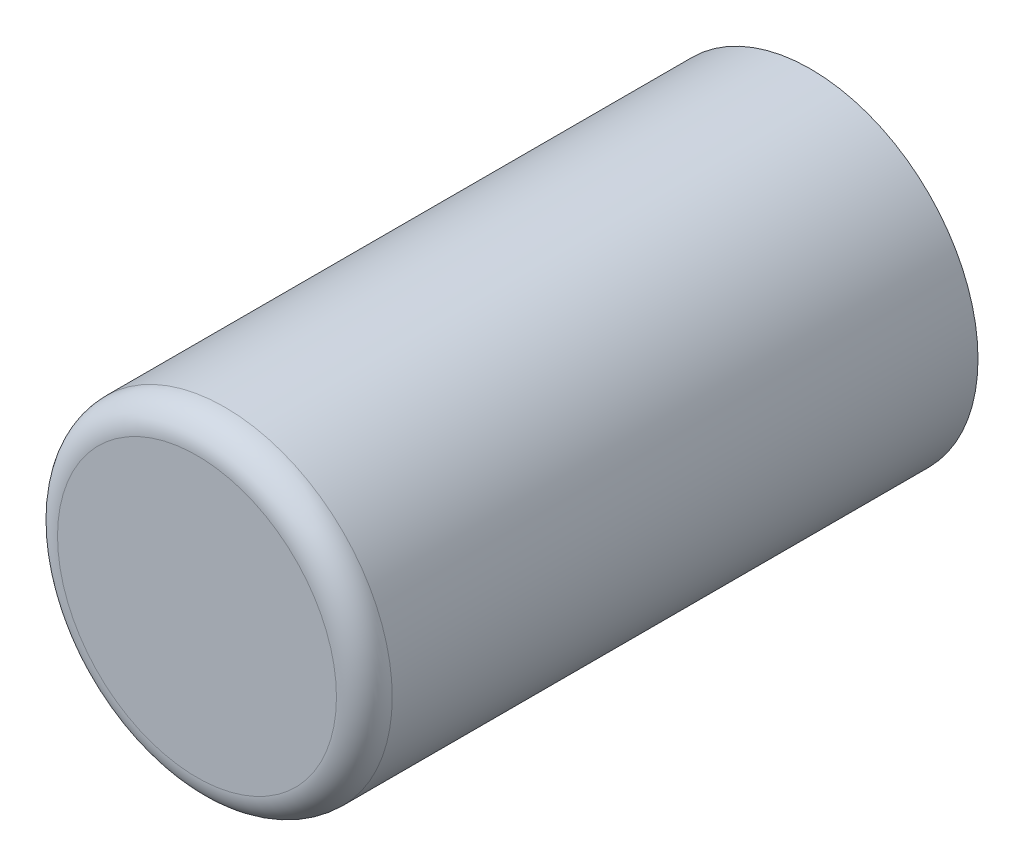
ISO-10303-21;
HEADER;
FILE_DESCRIPTION(('STEP AP214'),'2;1');
FILE_NAME('part.step','',(''),(''),'','','');
FILE_SCHEMA(('AUTOMOTIVE_DESIGN { 1 0 10303 214 1 1 1 1 }'));
ENDSEC;
DATA;
#1=APPLICATION_CONTEXT('core data for automotive mechanical design processes');
#2=APPLICATION_PROTOCOL_DEFINITION('international standard','automotive_design',2000,#1);
#3=PRODUCT_CONTEXT('',#1,'mechanical');
#4=PRODUCT('Part','Part','',(#3));
#5=PRODUCT_RELATED_PRODUCT_CATEGORY('part','',(#4));
#6=PRODUCT_DEFINITION_FORMATION('','',#4);
#7=PRODUCT_DEFINITION_CONTEXT('part definition',#1,'design');
#8=PRODUCT_DEFINITION('design','',#6,#7);
#9=PRODUCT_DEFINITION_SHAPE('','',#8);
#10=(LENGTH_UNIT() NAMED_UNIT(*) SI_UNIT(.MILLI.,.METRE.));
#11=(NAMED_UNIT(*) PLANE_ANGLE_UNIT() SI_UNIT($,.RADIAN.));
#12=(NAMED_UNIT(*) SI_UNIT($,.STERADIAN.) SOLID_ANGLE_UNIT());
#13=UNCERTAINTY_MEASURE_WITH_UNIT(LENGTH_MEASURE(1.E-05),#10,'distance_accuracy_value','');
#14=(GEOMETRIC_REPRESENTATION_CONTEXT(3) GLOBAL_UNCERTAINTY_ASSIGNED_CONTEXT((#13)) GLOBAL_UNIT_ASSIGNED_CONTEXT((#10,
#11,#12)) REPRESENTATION_CONTEXT('',''));
#15=CARTESIAN_POINT('',(0.,0.,0.));
#16=DIRECTION('',(0.,0.,1.));
#17=DIRECTION('',(1.,0.,0.));
#18=AXIS2_PLACEMENT_3D('',#15,#16,#17);
#19=CARTESIAN_POINT('',(0.,0.,110.));
#20=DIRECTION('',(0.,0.,-1.));
#21=DIRECTION('',(-1.,0.,0.));
#22=AXIS2_PLACEMENT_3D('',#19,#20,#21);
#23=CYLINDRICAL_SURFACE('',#22,30.);
#24=CARTESIAN_POINT('',(0.,0.,105.));
#25=DIRECTION('',(0.,0.,1.));
#26=DIRECTION('',(1.,0.,0.));
#27=AXIS2_PLACEMENT_3D('',#24,#25,#26);
#28=CIRCLE('',#27,30.);
#29=CARTESIAN_POINT('',(30.,0.,105.));
#30=VERTEX_POINT('',#29);
#31=EDGE_CURVE('E10',#30,#30,#28,.F.);
#32=ORIENTED_EDGE('',*,*,#31,.T.);
#33=EDGE_LOOP('',(#32));
#34=FACE_BOUND('',#33,.T.);
#35=CARTESIAN_POINT('',(0.,0.,0.));
#36=DIRECTION('',(0.,0.,1.));
#37=DIRECTION('',(1.,0.,0.));
#38=AXIS2_PLACEMENT_3D('',#35,#36,#37);
#39=CIRCLE('',#38,30.);
#40=CARTESIAN_POINT('',(30.,0.,0.));
#41=VERTEX_POINT('',#40);
#42=EDGE_CURVE('E46',#41,#41,#39,.T.);
#43=ORIENTED_EDGE('',*,*,#42,.T.);
#44=EDGE_LOOP('',(#43));
#45=FACE_BOUND('',#44,.T.);
#46=ADVANCED_FACE('F35',(#34,#45),#23,.T.);
#47=CARTESIAN_POINT('',(0.,0.,110.));
#48=DIRECTION('',(0.,0.,1.));
#49=DIRECTION('',(1.,0.,0.));
#50=AXIS2_PLACEMENT_3D('',#47,#48,#49);
#51=PLANE('',#50);
#52=CARTESIAN_POINT('',(0.,0.,110.));
#53=DIRECTION('',(0.,0.,1.));
#54=DIRECTION('',(1.,0.,0.));
#55=AXIS2_PLACEMENT_3D('',#52,#53,#54);
#56=CIRCLE('',#55,25.);
#57=CARTESIAN_POINT('',(25.,0.,110.));
#58=VERTEX_POINT('',#57);
#59=EDGE_CURVE('E42',#58,#58,#56,.T.);
#60=ORIENTED_EDGE('',*,*,#59,.T.);
#61=EDGE_LOOP('',(#60));
#62=FACE_BOUND('',#61,.T.);
#63=ADVANCED_FACE('F75',(#62),#51,.T.);
#64=CARTESIAN_POINT('',(0.,0.,0.));
#65=DIRECTION('',(0.,0.,1.));
#66=DIRECTION('',(1.,0.,0.));
#67=AXIS2_PLACEMENT_3D('',#64,#65,#66);
#68=PLANE('',#67);
#69=CARTESIAN_POINT('',(0.,0.,0.));
#70=DIRECTION('',(0.,0.,1.));
#71=DIRECTION('',(1.,0.,0.));
#72=AXIS2_PLACEMENT_3D('',#69,#70,#71);
#73=CIRCLE('',#72,29.);
#74=CARTESIAN_POINT('',(29.,0.,0.));
#75=VERTEX_POINT('',#74);
#76=EDGE_CURVE('E53',#75,#75,#73,.T.);
#77=ORIENTED_EDGE('',*,*,#76,.T.);
#78=EDGE_LOOP('',(#77));
#79=FACE_BOUND('',#78,.T.);
#80=ORIENTED_EDGE('',*,*,#42,.F.);
#81=EDGE_LOOP('',(#80));
#82=FACE_BOUND('',#81,.T.);
#83=ADVANCED_FACE('F72',(#79,#82),#68,.F.);
#84=CARTESIAN_POINT('',(0.,0.,105.));
#85=DIRECTION('',(0.,0.,1.));
#86=DIRECTION('',(1.,0.,0.));
#87=AXIS2_PLACEMENT_3D('',#84,#85,#86);
#88=TOROIDAL_SURFACE('',#87,25.,5.);
#89=ORIENTED_EDGE('',*,*,#31,.F.);
#90=EDGE_LOOP('',(#89));
#91=FACE_BOUND('',#90,.T.);
#92=ORIENTED_EDGE('',*,*,#59,.F.);
#93=EDGE_LOOP('',(#92));
#94=FACE_BOUND('',#93,.T.);
#95=ADVANCED_FACE('F37',(#91,#94),#88,.T.);
#96=CARTESIAN_POINT('',(0.,0.,110.));
#97=DIRECTION('',(0.,0.,-1.));
#98=DIRECTION('',(-1.,0.,0.));
#99=AXIS2_PLACEMENT_3D('',#96,#97,#98);
#100=CYLINDRICAL_SURFACE('',#99,29.);
#101=CARTESIAN_POINT('',(0.,0.,105.));
#102=DIRECTION('',(0.,0.,-1.));
#103=DIRECTION('',(-1.,0.,0.));
#104=AXIS2_PLACEMENT_3D('',#101,#102,#103);
#105=CIRCLE('',#104,29.);
#106=CARTESIAN_POINT('',(-29.,0.,105.));
#107=VERTEX_POINT('',#106);
#108=EDGE_CURVE('E50',#107,#107,#105,.T.);
#109=ORIENTED_EDGE('',*,*,#108,.F.);
#110=EDGE_LOOP('',(#109));
#111=FACE_BOUND('',#110,.T.);
#112=ORIENTED_EDGE('',*,*,#76,.F.);
#113=EDGE_LOOP('',(#112));
#114=FACE_BOUND('',#113,.T.);
#115=ADVANCED_FACE('F65',(#111,#114),#100,.F.);
#116=CARTESIAN_POINT('',(0.,0.,109.));
#117=DIRECTION('',(0.,0.,1.));
#118=DIRECTION('',(1.,0.,0.));
#119=AXIS2_PLACEMENT_3D('',#116,#117,#118);
#120=PLANE('',#119);
#121=CARTESIAN_POINT('',(0.,0.,109.));
#122=DIRECTION('',(0.,0.,1.));
#123=DIRECTION('',(1.,0.,0.));
#124=AXIS2_PLACEMENT_3D('',#121,#122,#123);
#125=CIRCLE('',#124,25.);
#126=CARTESIAN_POINT('',(25.,0.,109.));
#127=VERTEX_POINT('',#126);
#128=EDGE_CURVE('E56',#127,#127,#125,.T.);
#129=ORIENTED_EDGE('',*,*,#128,.F.);
#130=EDGE_LOOP('',(#129));
#131=FACE_BOUND('',#130,.T.);
#132=ADVANCED_FACE('F68',(#131),#120,.F.);
#133=CARTESIAN_POINT('',(0.,0.,105.));
#134=DIRECTION('',(0.,0.,1.));
#135=DIRECTION('',(1.,0.,0.));
#136=AXIS2_PLACEMENT_3D('',#133,#134,#135);
#137=TOROIDAL_SURFACE('',#136,25.,4.);
#138=ORIENTED_EDGE('',*,*,#108,.T.);
#139=EDGE_LOOP('',(#138));
#140=FACE_BOUND('',#139,.T.);
#141=ORIENTED_EDGE('',*,*,#128,.T.);
#142=EDGE_LOOP('',(#141));
#143=FACE_BOUND('',#142,.T.);
#144=ADVANCED_FACE('F62',(#140,#143),#137,.F.);
#145=CLOSED_SHELL('',(#46,#63,#83,#95,#115,#132,#144));
#146=MANIFOLD_SOLID_BREP('B2',#145);
#147=ADVANCED_BREP_SHAPE_REPRESENTATION('',(#18,#146),#14);
#148=SHAPE_DEFINITION_REPRESENTATION(#9,#147);
ENDSEC;
END-ISO-10303-21;
